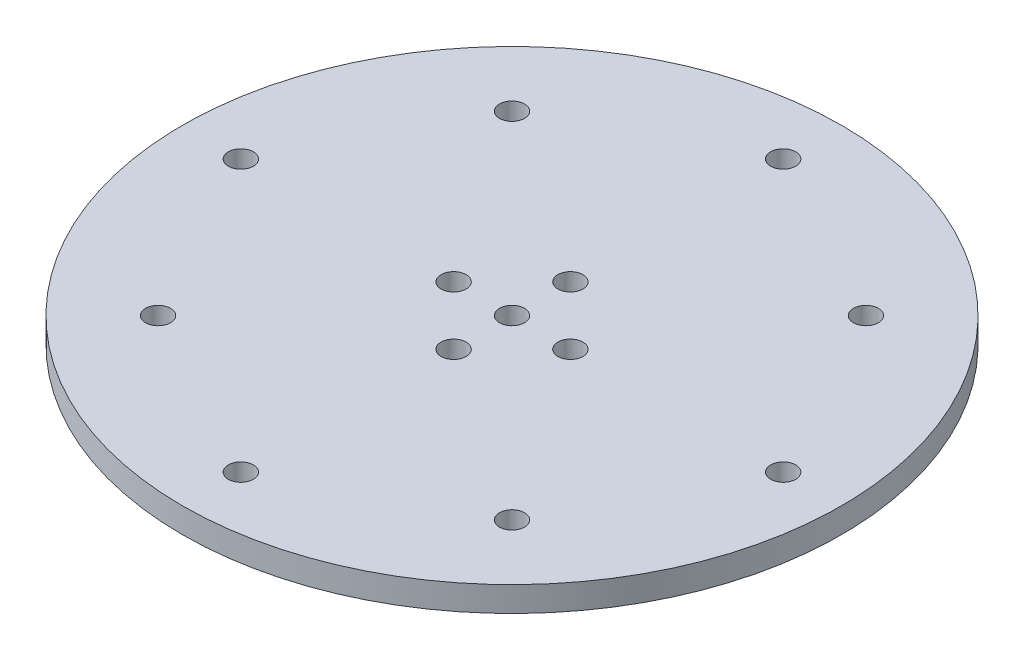
ISO-10303-21;
HEADER;
FILE_DESCRIPTION(('STEP AP214'),'2;1');
FILE_NAME('part.step','',(''),(''),'','','');
FILE_SCHEMA(('AUTOMOTIVE_DESIGN { 1 0 10303 214 1 1 1 1 }'));
ENDSEC;
DATA;
#1=APPLICATION_CONTEXT('core data for automotive mechanical design processes');
#2=APPLICATION_PROTOCOL_DEFINITION('international standard','automotive_design',2000,#1);
#3=PRODUCT_CONTEXT('',#1,'mechanical');
#4=PRODUCT('Part','Part','',(#3));
#5=PRODUCT_RELATED_PRODUCT_CATEGORY('part','',(#4));
#6=PRODUCT_DEFINITION_FORMATION('','',#4);
#7=PRODUCT_DEFINITION_CONTEXT('part definition',#1,'design');
#8=PRODUCT_DEFINITION('design','',#6,#7);
#9=PRODUCT_DEFINITION_SHAPE('','',#8);
#10=(LENGTH_UNIT() NAMED_UNIT(*) SI_UNIT(.MILLI.,.METRE.));
#11=(NAMED_UNIT(*) PLANE_ANGLE_UNIT() SI_UNIT($,.RADIAN.));
#12=(NAMED_UNIT(*) SI_UNIT($,.STERADIAN.) SOLID_ANGLE_UNIT());
#13=UNCERTAINTY_MEASURE_WITH_UNIT(LENGTH_MEASURE(1.E-05),#10,'distance_accuracy_value','');
#14=(GEOMETRIC_REPRESENTATION_CONTEXT(3) GLOBAL_UNCERTAINTY_ASSIGNED_CONTEXT((#13)) GLOBAL_UNIT_ASSIGNED_CONTEXT((#10,
#11,#12)) REPRESENTATION_CONTEXT('',''));
#15=CARTESIAN_POINT('',(0.,0.,0.));
#16=DIRECTION('',(0.,0.,1.));
#17=DIRECTION('',(1.,0.,0.));
#18=AXIS2_PLACEMENT_3D('',#15,#16,#17);
#19=CARTESIAN_POINT('',(0.,3.,0.));
#20=DIRECTION('',(0.,1.,0.));
#21=DIRECTION('',(0.,0.,1.));
#22=AXIS2_PLACEMENT_3D('',#19,#20,#21);
#23=PLANE('',#22);
#24=CARTESIAN_POINT('',(0.,3.,-7.));
#25=DIRECTION('',(0.,1.,0.));
#26=DIRECTION('',(0.,0.,1.));
#27=AXIS2_PLACEMENT_3D('',#24,#25,#26);
#28=CIRCLE('',#27,1.5);
#29=CARTESIAN_POINT('',(0.,3.,-5.5));
#30=VERTEX_POINT('',#29);
#31=EDGE_CURVE('E117',#30,#30,#28,.T.);
#32=ORIENTED_EDGE('',*,*,#31,.F.);
#33=EDGE_LOOP('',(#32));
#34=FACE_BOUND('',#33,.T.);
#35=CARTESIAN_POINT('',(7.0000000000004,3.,-3.96618052886551E-13));
#36=DIRECTION('',(0.,1.,0.));
#37=DIRECTION('',(0.,0.,1.));
#38=AXIS2_PLACEMENT_3D('',#35,#36,#37);
#39=CIRCLE('',#38,1.50000000000029);
#40=CARTESIAN_POINT('',(7.0000000000004,3.,1.49999999999989));
#41=VERTEX_POINT('',#40);
#42=EDGE_CURVE('E124',#41,#41,#39,.T.);
#43=ORIENTED_EDGE('',*,*,#42,.F.);
#44=EDGE_LOOP('',(#43));
#45=FACE_BOUND('',#44,.T.);
#46=CARTESIAN_POINT('',(7.93236105773103E-13,3.,7.));
#47=DIRECTION('',(0.,1.,0.));
#48=DIRECTION('',(0.,0.,1.));
#49=AXIS2_PLACEMENT_3D('',#46,#47,#48);
#50=CIRCLE('',#49,1.50000000000081);
#51=CARTESIAN_POINT('',(7.93236105773103E-13,3.,8.5000000000008));
#52=VERTEX_POINT('',#51);
#53=EDGE_CURVE('E128',#52,#52,#50,.T.);
#54=ORIENTED_EDGE('',*,*,#53,.F.);
#55=EDGE_LOOP('',(#54));
#56=FACE_BOUND('',#55,.T.);
#57=CARTESIAN_POINT('',(-6.9999999999996,3.,3.97475305645955E-13));
#58=DIRECTION('',(0.,1.,0.));
#59=DIRECTION('',(0.,0.,1.));
#60=AXIS2_PLACEMENT_3D('',#57,#58,#59);
#61=CIRCLE('',#60,1.50000000000057);
#62=CARTESIAN_POINT('',(-6.9999999999996,3.,1.50000000000096));
#63=VERTEX_POINT('',#62);
#64=EDGE_CURVE('E132',#63,#63,#61,.T.);
#65=ORIENTED_EDGE('',*,*,#64,.F.);
#66=EDGE_LOOP('',(#65));
#67=FACE_BOUND('',#66,.T.);
#68=CARTESIAN_POINT('',(0.,3.,0.));
#69=DIRECTION('',(0.,1.,0.));
#70=DIRECTION('',(0.,0.,1.));
#71=AXIS2_PLACEMENT_3D('',#68,#69,#70);
#72=CIRCLE('',#71,1.5);
#73=CARTESIAN_POINT('',(0.,3.,1.5));
#74=VERTEX_POINT('',#73);
#75=EDGE_CURVE('E136',#74,#74,#72,.T.);
#76=ORIENTED_EDGE('',*,*,#75,.F.);
#77=EDGE_LOOP('',(#76));
#78=FACE_BOUND('',#77,.T.);
#79=CARTESIAN_POINT('',(-21.2132034355942,3.,21.2132034355986));
#80=DIRECTION('',(0.,1.,0.));
#81=DIRECTION('',(0.,0.,1.));
#82=AXIS2_PLACEMENT_3D('',#79,#80,#81);
#83=CIRCLE('',#82,1.5);
#84=CARTESIAN_POINT('',(-21.2132034355942,3.,22.7132034355986));
#85=VERTEX_POINT('',#84);
#86=EDGE_CURVE('E101',#85,#85,#83,.T.);
#87=ORIENTED_EDGE('',*,*,#86,.F.);
#88=EDGE_LOOP('',(#87));
#89=FACE_BOUND('',#88,.T.);
#90=CARTESIAN_POINT('',(21.2132034355964,3.,-21.2132034355965));
#91=DIRECTION('',(0.,1.,0.));
#92=DIRECTION('',(0.,0.,1.));
#93=AXIS2_PLACEMENT_3D('',#90,#91,#92);
#94=CIRCLE('',#93,1.5);
#95=CARTESIAN_POINT('',(21.2132034355964,3.,-19.7132034355965));
#96=VERTEX_POINT('',#95);
#97=EDGE_CURVE('E85',#96,#96,#94,.T.);
#98=ORIENTED_EDGE('',*,*,#97,.F.);
#99=EDGE_LOOP('',(#98));
#100=FACE_BOUND('',#99,.T.);
#101=CARTESIAN_POINT('',(-2.26946287024804E-13,3.,32.5));
#102=DIRECTION('',(0.,1.,0.));
#103=DIRECTION('',(0.,0.,1.));
#104=AXIS2_PLACEMENT_3D('',#101,#102,#103);
#105=CIRCLE('',#104,1.5);
#106=CARTESIAN_POINT('',(-2.26946287024804E-13,3.,34.));
#107=VERTEX_POINT('',#106);
#108=EDGE_CURVE('E69',#107,#107,#105,.T.);
#109=ORIENTED_EDGE('',*,*,#108,.F.);
#110=EDGE_LOOP('',(#109));
#111=FACE_BOUND('',#110,.T.);
#112=CARTESIAN_POINT('',(0.,3.,-32.5));
#113=DIRECTION('',(0.,1.,0.));
#114=DIRECTION('',(0.,0.,1.));
#115=AXIS2_PLACEMENT_3D('',#112,#113,#114);
#116=CIRCLE('',#115,1.5);
#117=CARTESIAN_POINT('',(0.,3.,-31.));
#118=VERTEX_POINT('',#117);
#119=EDGE_CURVE('E55',#118,#118,#116,.T.);
#120=ORIENTED_EDGE('',*,*,#119,.F.);
#121=EDGE_LOOP('',(#120));
#122=FACE_BOUND('',#121,.T.);
#123=CARTESIAN_POINT('',(0.,3.,0.));
#124=DIRECTION('',(0.,1.,0.));
#125=DIRECTION('',(0.,0.,1.));
#126=AXIS2_PLACEMENT_3D('',#123,#124,#125);
#127=CIRCLE('',#126,39.5);
#128=CARTESIAN_POINT('',(0.,3.,39.5));
#129=VERTEX_POINT('',#128);
#130=EDGE_CURVE('E10',#129,#129,#127,.T.);
#131=ORIENTED_EDGE('',*,*,#130,.T.);
#132=EDGE_LOOP('',(#131));
#133=FACE_BOUND('',#132,.T.);
#134=CARTESIAN_POINT('',(32.5,3.,1.13473143512402E-13));
#135=DIRECTION('',(0.,1.,0.));
#136=DIRECTION('',(0.,0.,1.));
#137=AXIS2_PLACEMENT_3D('',#134,#135,#136);
#138=CIRCLE('',#137,1.5);
#139=CARTESIAN_POINT('',(32.5,3.,1.50000000000011));
#140=VERTEX_POINT('',#139);
#141=EDGE_CURVE('E61',#140,#140,#138,.T.);
#142=ORIENTED_EDGE('',*,*,#141,.F.);
#143=EDGE_LOOP('',(#142));
#144=FACE_BOUND('',#143,.T.);
#145=CARTESIAN_POINT('',(-32.5,3.,-3.40419430537206E-13));
#146=DIRECTION('',(0.,1.,0.));
#147=DIRECTION('',(0.,0.,1.));
#148=AXIS2_PLACEMENT_3D('',#145,#146,#147);
#149=CIRCLE('',#148,1.5);
#150=CARTESIAN_POINT('',(-32.5,3.,1.49999999999966));
#151=VERTEX_POINT('',#150);
#152=EDGE_CURVE('E77',#151,#151,#149,.T.);
#153=ORIENTED_EDGE('',*,*,#152,.F.);
#154=EDGE_LOOP('',(#153));
#155=FACE_BOUND('',#154,.T.);
#156=CARTESIAN_POINT('',(21.2132034355986,3.,21.2132034355964));
#157=DIRECTION('',(0.,1.,0.));
#158=DIRECTION('',(0.,0.,1.));
#159=AXIS2_PLACEMENT_3D('',#156,#157,#158);
#160=CIRCLE('',#159,1.5);
#161=CARTESIAN_POINT('',(21.2132034355986,3.,22.7132034355964));
#162=VERTEX_POINT('',#161);
#163=EDGE_CURVE('E93',#162,#162,#160,.T.);
#164=ORIENTED_EDGE('',*,*,#163,.F.);
#165=EDGE_LOOP('',(#164));
#166=FACE_BOUND('',#165,.T.);
#167=CARTESIAN_POINT('',(-21.2132034355965,3.,-21.2132034355942));
#168=DIRECTION('',(0.,1.,0.));
#169=DIRECTION('',(0.,0.,1.));
#170=AXIS2_PLACEMENT_3D('',#167,#168,#169);
#171=CIRCLE('',#170,1.5);
#172=CARTESIAN_POINT('',(-21.2132034355965,3.,-19.7132034355942));
#173=VERTEX_POINT('',#172);
#174=EDGE_CURVE('E109',#173,#173,#171,.T.);
#175=ORIENTED_EDGE('',*,*,#174,.F.);
#176=EDGE_LOOP('',(#175));
#177=FACE_BOUND('',#176,.T.);
#178=ADVANCED_FACE('F42',(#34,#45,#56,#67,#78,#89,#100,#111,#122,#133,#144,#155,#166,#177),#23,.T.);
#179=CARTESIAN_POINT('',(0.,0.,0.));
#180=DIRECTION('',(0.,1.,0.));
#181=DIRECTION('',(0.,0.,1.));
#182=AXIS2_PLACEMENT_3D('',#179,#180,#181);
#183=PLANE('',#182);
#184=CARTESIAN_POINT('',(0.,0.,-7.));
#185=DIRECTION('',(0.,1.,0.));
#186=DIRECTION('',(0.,0.,1.));
#187=AXIS2_PLACEMENT_3D('',#184,#185,#186);
#188=CIRCLE('',#187,1.5);
#189=CARTESIAN_POINT('',(0.,0.,-5.5));
#190=VERTEX_POINT('',#189);
#191=EDGE_CURVE('E144',#190,#190,#188,.T.);
#192=ORIENTED_EDGE('',*,*,#191,.T.);
#193=EDGE_LOOP('',(#192));
#194=FACE_BOUND('',#193,.T.);
#195=CARTESIAN_POINT('',(7.0000000000004,0.,-3.96618052886551E-13));
#196=DIRECTION('',(0.,1.,0.));
#197=DIRECTION('',(0.,0.,1.));
#198=AXIS2_PLACEMENT_3D('',#195,#196,#197);
#199=CIRCLE('',#198,1.50000000000029);
#200=CARTESIAN_POINT('',(7.0000000000004,0.,1.49999999999989));
#201=VERTEX_POINT('',#200);
#202=EDGE_CURVE('E145',#201,#201,#199,.T.);
#203=ORIENTED_EDGE('',*,*,#202,.T.);
#204=EDGE_LOOP('',(#203));
#205=FACE_BOUND('',#204,.T.);
#206=CARTESIAN_POINT('',(7.93236105773103E-13,0.,7.));
#207=DIRECTION('',(0.,1.,0.));
#208=DIRECTION('',(0.,0.,1.));
#209=AXIS2_PLACEMENT_3D('',#206,#207,#208);
#210=CIRCLE('',#209,1.50000000000081);
#211=CARTESIAN_POINT('',(7.93236105773103E-13,0.,8.5000000000008));
#212=VERTEX_POINT('',#211);
#213=EDGE_CURVE('E149',#212,#212,#210,.T.);
#214=ORIENTED_EDGE('',*,*,#213,.T.);
#215=EDGE_LOOP('',(#214));
#216=FACE_BOUND('',#215,.T.);
#217=CARTESIAN_POINT('',(-6.9999999999996,0.,3.97475305645955E-13));
#218=DIRECTION('',(0.,1.,0.));
#219=DIRECTION('',(0.,0.,1.));
#220=AXIS2_PLACEMENT_3D('',#217,#218,#219);
#221=CIRCLE('',#220,1.50000000000057);
#222=CARTESIAN_POINT('',(-6.9999999999996,0.,1.50000000000096));
#223=VERTEX_POINT('',#222);
#224=EDGE_CURVE('E153',#223,#223,#221,.T.);
#225=ORIENTED_EDGE('',*,*,#224,.T.);
#226=EDGE_LOOP('',(#225));
#227=FACE_BOUND('',#226,.T.);
#228=CARTESIAN_POINT('',(0.,0.,0.));
#229=DIRECTION('',(0.,1.,0.));
#230=DIRECTION('',(0.,0.,1.));
#231=AXIS2_PLACEMENT_3D('',#228,#229,#230);
#232=CIRCLE('',#231,1.5);
#233=CARTESIAN_POINT('',(0.,0.,1.5));
#234=VERTEX_POINT('',#233);
#235=EDGE_CURVE('E140',#234,#234,#232,.T.);
#236=ORIENTED_EDGE('',*,*,#235,.T.);
#237=EDGE_LOOP('',(#236));
#238=FACE_BOUND('',#237,.T.);
#239=CARTESIAN_POINT('',(0.,0.,0.));
#240=DIRECTION('',(0.,1.,0.));
#241=DIRECTION('',(0.,0.,1.));
#242=AXIS2_PLACEMENT_3D('',#239,#240,#241);
#243=CIRCLE('',#242,39.5);
#244=CARTESIAN_POINT('',(0.,0.,39.5));
#245=VERTEX_POINT('',#244);
#246=EDGE_CURVE('E46',#245,#245,#243,.T.);
#247=ORIENTED_EDGE('',*,*,#246,.F.);
#248=EDGE_LOOP('',(#247));
#249=FACE_BOUND('',#248,.T.);
#250=CARTESIAN_POINT('',(0.,0.,-32.5));
#251=DIRECTION('',(0.,1.,0.));
#252=DIRECTION('',(0.,0.,1.));
#253=AXIS2_PLACEMENT_3D('',#250,#251,#252);
#254=CIRCLE('',#253,1.5);
#255=CARTESIAN_POINT('',(0.,0.,-31.));
#256=VERTEX_POINT('',#255);
#257=EDGE_CURVE('E57',#256,#256,#254,.T.);
#258=ORIENTED_EDGE('',*,*,#257,.T.);
#259=EDGE_LOOP('',(#258));
#260=FACE_BOUND('',#259,.T.);
#261=CARTESIAN_POINT('',(32.5,0.,1.13473143512402E-13));
#262=DIRECTION('',(0.,1.,0.));
#263=DIRECTION('',(0.,0.,1.));
#264=AXIS2_PLACEMENT_3D('',#261,#262,#263);
#265=CIRCLE('',#264,1.5);
#266=CARTESIAN_POINT('',(32.5,0.,1.50000000000011));
#267=VERTEX_POINT('',#266);
#268=EDGE_CURVE('E65',#267,#267,#265,.T.);
#269=ORIENTED_EDGE('',*,*,#268,.T.);
#270=EDGE_LOOP('',(#269));
#271=FACE_BOUND('',#270,.T.);
#272=CARTESIAN_POINT('',(-2.26946287024804E-13,0.,32.5));
#273=DIRECTION('',(0.,1.,0.));
#274=DIRECTION('',(0.,0.,1.));
#275=AXIS2_PLACEMENT_3D('',#272,#273,#274);
#276=CIRCLE('',#275,1.5);
#277=CARTESIAN_POINT('',(-2.26946287024804E-13,0.,34.));
#278=VERTEX_POINT('',#277);
#279=EDGE_CURVE('E73',#278,#278,#276,.T.);
#280=ORIENTED_EDGE('',*,*,#279,.T.);
#281=EDGE_LOOP('',(#280));
#282=FACE_BOUND('',#281,.T.);
#283=CARTESIAN_POINT('',(-32.5,0.,-3.40419430537206E-13));
#284=DIRECTION('',(0.,1.,0.));
#285=DIRECTION('',(0.,0.,1.));
#286=AXIS2_PLACEMENT_3D('',#283,#284,#285);
#287=CIRCLE('',#286,1.5);
#288=CARTESIAN_POINT('',(-32.5,0.,1.49999999999966));
#289=VERTEX_POINT('',#288);
#290=EDGE_CURVE('E81',#289,#289,#287,.T.);
#291=ORIENTED_EDGE('',*,*,#290,.T.);
#292=EDGE_LOOP('',(#291));
#293=FACE_BOUND('',#292,.T.);
#294=CARTESIAN_POINT('',(21.2132034355964,0.,-21.2132034355965));
#295=DIRECTION('',(0.,1.,0.));
#296=DIRECTION('',(0.,0.,1.));
#297=AXIS2_PLACEMENT_3D('',#294,#295,#296);
#298=CIRCLE('',#297,1.5);
#299=CARTESIAN_POINT('',(21.2132034355964,0.,-19.7132034355965));
#300=VERTEX_POINT('',#299);
#301=EDGE_CURVE('E89',#300,#300,#298,.T.);
#302=ORIENTED_EDGE('',*,*,#301,.T.);
#303=EDGE_LOOP('',(#302));
#304=FACE_BOUND('',#303,.T.);
#305=CARTESIAN_POINT('',(21.2132034355986,0.,21.2132034355964));
#306=DIRECTION('',(0.,1.,0.));
#307=DIRECTION('',(0.,0.,1.));
#308=AXIS2_PLACEMENT_3D('',#305,#306,#307);
#309=CIRCLE('',#308,1.5);
#310=CARTESIAN_POINT('',(21.2132034355986,0.,22.7132034355964));
#311=VERTEX_POINT('',#310);
#312=EDGE_CURVE('E97',#311,#311,#309,.T.);
#313=ORIENTED_EDGE('',*,*,#312,.T.);
#314=EDGE_LOOP('',(#313));
#315=FACE_BOUND('',#314,.T.);
#316=CARTESIAN_POINT('',(-21.2132034355942,0.,21.2132034355986));
#317=DIRECTION('',(0.,1.,0.));
#318=DIRECTION('',(0.,0.,1.));
#319=AXIS2_PLACEMENT_3D('',#316,#317,#318);
#320=CIRCLE('',#319,1.5);
#321=CARTESIAN_POINT('',(-21.2132034355942,0.,22.7132034355986));
#322=VERTEX_POINT('',#321);
#323=EDGE_CURVE('E105',#322,#322,#320,.T.);
#324=ORIENTED_EDGE('',*,*,#323,.T.);
#325=EDGE_LOOP('',(#324));
#326=FACE_BOUND('',#325,.T.);
#327=CARTESIAN_POINT('',(-21.2132034355965,0.,-21.2132034355942));
#328=DIRECTION('',(0.,1.,0.));
#329=DIRECTION('',(0.,0.,1.));
#330=AXIS2_PLACEMENT_3D('',#327,#328,#329);
#331=CIRCLE('',#330,1.5);
#332=CARTESIAN_POINT('',(-21.2132034355965,0.,-19.7132034355942));
#333=VERTEX_POINT('',#332);
#334=EDGE_CURVE('E113',#333,#333,#331,.T.);
#335=ORIENTED_EDGE('',*,*,#334,.T.);
#336=EDGE_LOOP('',(#335));
#337=FACE_BOUND('',#336,.T.);
#338=ADVANCED_FACE('F161',(#194,#205,#216,#227,#238,#249,#260,#271,#282,#293,#304,#315,#326,
#337),#183,.F.);
#339=CARTESIAN_POINT('',(0.,3.,0.));
#340=DIRECTION('',(0.,-1.,0.));
#341=DIRECTION('',(0.,0.,-1.));
#342=AXIS2_PLACEMENT_3D('',#339,#340,#341);
#343=CYLINDRICAL_SURFACE('',#342,39.5);
#344=ORIENTED_EDGE('',*,*,#130,.F.);
#345=EDGE_LOOP('',(#344));
#346=FACE_BOUND('',#345,.T.);
#347=ORIENTED_EDGE('',*,*,#246,.T.);
#348=EDGE_LOOP('',(#347));
#349=FACE_BOUND('',#348,.T.);
#350=ADVANCED_FACE('F44',(#346,#349),#343,.T.);
#351=CARTESIAN_POINT('',(0.,3.,-32.5));
#352=DIRECTION('',(0.,-1.,0.));
#353=DIRECTION('',(0.,0.,-1.));
#354=AXIS2_PLACEMENT_3D('',#351,#352,#353);
#355=CYLINDRICAL_SURFACE('',#354,1.5);
#356=ORIENTED_EDGE('',*,*,#119,.T.);
#357=EDGE_LOOP('',(#356));
#358=FACE_BOUND('',#357,.T.);
#359=ORIENTED_EDGE('',*,*,#257,.F.);
#360=EDGE_LOOP('',(#359));
#361=FACE_BOUND('',#360,.T.);
#362=ADVANCED_FACE('F190',(#358,#361),#355,.F.);
#363=CARTESIAN_POINT('',(32.5,3.,1.13473143512402E-13));
#364=DIRECTION('',(0.,-1.,0.));
#365=DIRECTION('',(0.,0.,-1.));
#366=AXIS2_PLACEMENT_3D('',#363,#364,#365);
#367=CYLINDRICAL_SURFACE('',#366,1.5);
#368=ORIENTED_EDGE('',*,*,#141,.T.);
#369=EDGE_LOOP('',(#368));
#370=FACE_BOUND('',#369,.T.);
#371=ORIENTED_EDGE('',*,*,#268,.F.);
#372=EDGE_LOOP('',(#371));
#373=FACE_BOUND('',#372,.T.);
#374=ADVANCED_FACE('F193',(#370,#373),#367,.F.);
#375=CARTESIAN_POINT('',(-2.26946287024804E-13,3.,32.5));
#376=DIRECTION('',(0.,-1.,0.));
#377=DIRECTION('',(0.,0.,-1.));
#378=AXIS2_PLACEMENT_3D('',#375,#376,#377);
#379=CYLINDRICAL_SURFACE('',#378,1.5);
#380=ORIENTED_EDGE('',*,*,#108,.T.);
#381=EDGE_LOOP('',(#380));
#382=FACE_BOUND('',#381,.T.);
#383=ORIENTED_EDGE('',*,*,#279,.F.);
#384=EDGE_LOOP('',(#383));
#385=FACE_BOUND('',#384,.T.);
#386=ADVANCED_FACE('F197',(#382,#385),#379,.F.);
#387=CARTESIAN_POINT('',(-32.5,3.,-3.40419430537206E-13));
#388=DIRECTION('',(0.,-1.,0.));
#389=DIRECTION('',(0.,0.,-1.));
#390=AXIS2_PLACEMENT_3D('',#387,#388,#389);
#391=CYLINDRICAL_SURFACE('',#390,1.5);
#392=ORIENTED_EDGE('',*,*,#152,.T.);
#393=EDGE_LOOP('',(#392));
#394=FACE_BOUND('',#393,.T.);
#395=ORIENTED_EDGE('',*,*,#290,.F.);
#396=EDGE_LOOP('',(#395));
#397=FACE_BOUND('',#396,.T.);
#398=ADVANCED_FACE('F201',(#394,#397),#391,.F.);
#399=CARTESIAN_POINT('',(21.2132034355964,3.,-21.2132034355965));
#400=DIRECTION('',(0.,-1.,0.));
#401=DIRECTION('',(0.,0.,-1.));
#402=AXIS2_PLACEMENT_3D('',#399,#400,#401);
#403=CYLINDRICAL_SURFACE('',#402,1.5);
#404=ORIENTED_EDGE('',*,*,#97,.T.);
#405=EDGE_LOOP('',(#404));
#406=FACE_BOUND('',#405,.T.);
#407=ORIENTED_EDGE('',*,*,#301,.F.);
#408=EDGE_LOOP('',(#407));
#409=FACE_BOUND('',#408,.T.);
#410=ADVANCED_FACE('F205',(#406,#409),#403,.F.);
#411=CARTESIAN_POINT('',(21.2132034355986,3.,21.2132034355964));
#412=DIRECTION('',(0.,-1.,0.));
#413=DIRECTION('',(0.,0.,-1.));
#414=AXIS2_PLACEMENT_3D('',#411,#412,#413);
#415=CYLINDRICAL_SURFACE('',#414,1.5);
#416=ORIENTED_EDGE('',*,*,#163,.T.);
#417=EDGE_LOOP('',(#416));
#418=FACE_BOUND('',#417,.T.);
#419=ORIENTED_EDGE('',*,*,#312,.F.);
#420=EDGE_LOOP('',(#419));
#421=FACE_BOUND('',#420,.T.);
#422=ADVANCED_FACE('F209',(#418,#421),#415,.F.);
#423=CARTESIAN_POINT('',(-21.2132034355942,3.,21.2132034355986));
#424=DIRECTION('',(0.,-1.,0.));
#425=DIRECTION('',(0.,0.,-1.));
#426=AXIS2_PLACEMENT_3D('',#423,#424,#425);
#427=CYLINDRICAL_SURFACE('',#426,1.5);
#428=ORIENTED_EDGE('',*,*,#86,.T.);
#429=EDGE_LOOP('',(#428));
#430=FACE_BOUND('',#429,.T.);
#431=ORIENTED_EDGE('',*,*,#323,.F.);
#432=EDGE_LOOP('',(#431));
#433=FACE_BOUND('',#432,.T.);
#434=ADVANCED_FACE('F213',(#430,#433),#427,.F.);
#435=CARTESIAN_POINT('',(-21.2132034355965,3.,-21.2132034355942));
#436=DIRECTION('',(0.,-1.,0.));
#437=DIRECTION('',(0.,0.,-1.));
#438=AXIS2_PLACEMENT_3D('',#435,#436,#437);
#439=CYLINDRICAL_SURFACE('',#438,1.5);
#440=ORIENTED_EDGE('',*,*,#174,.T.);
#441=EDGE_LOOP('',(#440));
#442=FACE_BOUND('',#441,.T.);
#443=ORIENTED_EDGE('',*,*,#334,.F.);
#444=EDGE_LOOP('',(#443));
#445=FACE_BOUND('',#444,.T.);
#446=ADVANCED_FACE('F217',(#442,#445),#439,.F.);
#447=CARTESIAN_POINT('',(0.,0.,0.));
#448=DIRECTION('',(0.,1.,0.));
#449=DIRECTION('',(0.,0.,1.));
#450=AXIS2_PLACEMENT_3D('',#447,#448,#449);
#451=CYLINDRICAL_SURFACE('',#450,1.5);
#452=ORIENTED_EDGE('',*,*,#75,.T.);
#453=EDGE_LOOP('',(#452));
#454=FACE_BOUND('',#453,.T.);
#455=ORIENTED_EDGE('',*,*,#235,.F.);
#456=EDGE_LOOP('',(#455));
#457=FACE_BOUND('',#456,.T.);
#458=ADVANCED_FACE('F177',(#454,#457),#451,.F.);
#459=CARTESIAN_POINT('',(-6.9999999999996,0.,3.97475305645955E-13));
#460=DIRECTION('',(0.,1.,0.));
#461=DIRECTION('',(0.,0.,1.));
#462=AXIS2_PLACEMENT_3D('',#459,#460,#461);
#463=CYLINDRICAL_SURFACE('',#462,1.50000000000057);
#464=ORIENTED_EDGE('',*,*,#64,.T.);
#465=EDGE_LOOP('',(#464));
#466=FACE_BOUND('',#465,.T.);
#467=ORIENTED_EDGE('',*,*,#224,.F.);
#468=EDGE_LOOP('',(#467));
#469=FACE_BOUND('',#468,.T.);
#470=ADVANCED_FACE('F167',(#466,#469),#463,.F.);
#471=CARTESIAN_POINT('',(7.93236105773103E-13,0.,7.));
#472=DIRECTION('',(0.,1.,0.));
#473=DIRECTION('',(0.,0.,1.));
#474=AXIS2_PLACEMENT_3D('',#471,#472,#473);
#475=CYLINDRICAL_SURFACE('',#474,1.50000000000081);
#476=ORIENTED_EDGE('',*,*,#53,.T.);
#477=EDGE_LOOP('',(#476));
#478=FACE_BOUND('',#477,.T.);
#479=ORIENTED_EDGE('',*,*,#213,.F.);
#480=EDGE_LOOP('',(#479));
#481=FACE_BOUND('',#480,.T.);
#482=ADVANCED_FACE('F164',(#478,#481),#475,.F.);
#483=CARTESIAN_POINT('',(7.0000000000004,0.,-3.96618052886551E-13));
#484=DIRECTION('',(0.,1.,0.));
#485=DIRECTION('',(0.,0.,1.));
#486=AXIS2_PLACEMENT_3D('',#483,#484,#485);
#487=CYLINDRICAL_SURFACE('',#486,1.50000000000029);
#488=ORIENTED_EDGE('',*,*,#42,.T.);
#489=EDGE_LOOP('',(#488));
#490=FACE_BOUND('',#489,.T.);
#491=ORIENTED_EDGE('',*,*,#202,.F.);
#492=EDGE_LOOP('',(#491));
#493=FACE_BOUND('',#492,.T.);
#494=ADVANCED_FACE('F166',(#490,#493),#487,.F.);
#495=CARTESIAN_POINT('',(0.,0.,-7.));
#496=DIRECTION('',(0.,1.,0.));
#497=DIRECTION('',(0.,0.,1.));
#498=AXIS2_PLACEMENT_3D('',#495,#496,#497);
#499=CYLINDRICAL_SURFACE('',#498,1.5);
#500=ORIENTED_EDGE('',*,*,#31,.T.);
#501=EDGE_LOOP('',(#500));
#502=FACE_BOUND('',#501,.T.);
#503=ORIENTED_EDGE('',*,*,#191,.F.);
#504=EDGE_LOOP('',(#503));
#505=FACE_BOUND('',#504,.T.);
#506=ADVANCED_FACE('F174',(#502,#505),#499,.F.);
#507=CLOSED_SHELL('',(#178,#338,#350,#362,#374,#386,#398,#410,#422,#434,#446,#458,#470,#482,
#494,#506));
#508=MANIFOLD_SOLID_BREP('B2',#507);
#509=ADVANCED_BREP_SHAPE_REPRESENTATION('',(#18,#508),#14);
#510=SHAPE_DEFINITION_REPRESENTATION(#9,#509);
ENDSEC;
END-ISO-10303-21;
